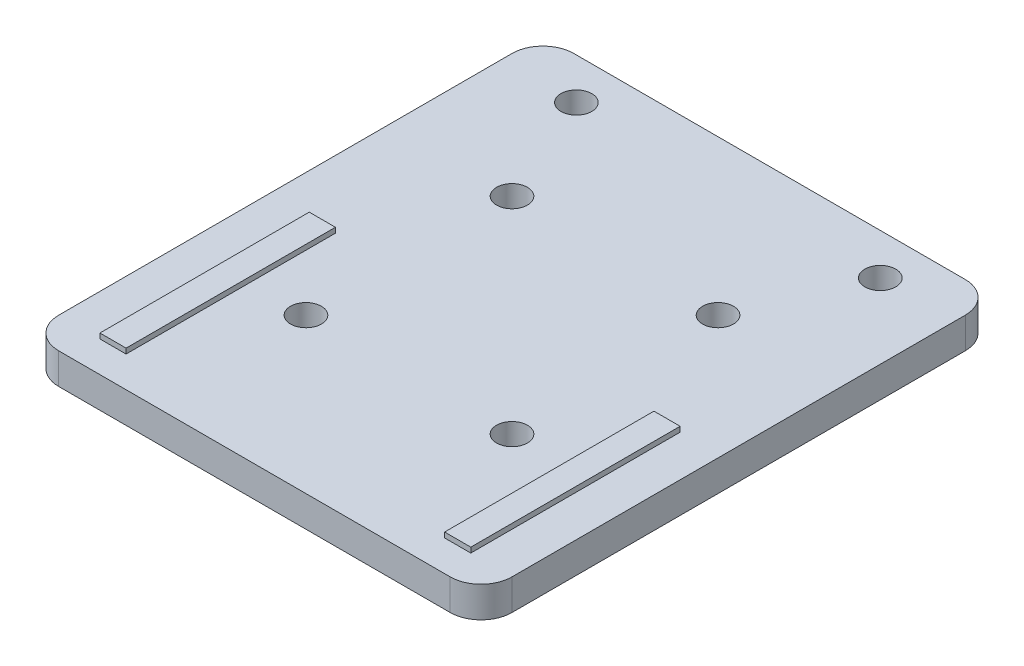
ISO-10303-21;
HEADER;
FILE_DESCRIPTION(('STEP AP214'),'2;1');
FILE_NAME('part.step','',(''),(''),'','','');
FILE_SCHEMA(('AUTOMOTIVE_DESIGN { 1 0 10303 214 1 1 1 1 }'));
ENDSEC;
DATA;
#1=APPLICATION_CONTEXT('core data for automotive mechanical design processes');
#2=APPLICATION_PROTOCOL_DEFINITION('international standard','automotive_design',2000,#1);
#3=PRODUCT_CONTEXT('',#1,'mechanical');
#4=PRODUCT('Part','Part','',(#3));
#5=PRODUCT_RELATED_PRODUCT_CATEGORY('part','',(#4));
#6=PRODUCT_DEFINITION_FORMATION('','',#4);
#7=PRODUCT_DEFINITION_CONTEXT('part definition',#1,'design');
#8=PRODUCT_DEFINITION('design','',#6,#7);
#9=PRODUCT_DEFINITION_SHAPE('','',#8);
#10=(LENGTH_UNIT() NAMED_UNIT(*) SI_UNIT(.MILLI.,.METRE.));
#11=(NAMED_UNIT(*) PLANE_ANGLE_UNIT() SI_UNIT($,.RADIAN.));
#12=(NAMED_UNIT(*) SI_UNIT($,.STERADIAN.) SOLID_ANGLE_UNIT());
#13=UNCERTAINTY_MEASURE_WITH_UNIT(LENGTH_MEASURE(1.E-05),#10,'distance_accuracy_value','');
#14=(GEOMETRIC_REPRESENTATION_CONTEXT(3) GLOBAL_UNCERTAINTY_ASSIGNED_CONTEXT((#13)) GLOBAL_UNIT_ASSIGNED_CONTEXT((#10,
#11,#12)) REPRESENTATION_CONTEXT('',''));
#15=CARTESIAN_POINT('',(0.,0.,0.));
#16=DIRECTION('',(0.,0.,1.));
#17=DIRECTION('',(1.,0.,0.));
#18=AXIS2_PLACEMENT_3D('',#15,#16,#17);
#19=CARTESIAN_POINT('',(0.,3.,0.));
#20=DIRECTION('',(0.,-1.,0.));
#21=DIRECTION('',(0.,0.,-1.));
#22=AXIS2_PLACEMENT_3D('',#19,#20,#21);
#23=PLANE('',#22);
#24=DIRECTION('',(1.,0.,0.));
#25=VECTOR('',#24,1.);
#26=CARTESIAN_POINT('',(-18.,3.,22.));
#27=LINE('',#26,#25);
#28=CARTESIAN_POINT('',(-18.,3.,22.));
#29=VERTEX_POINT('',#28);
#30=CARTESIAN_POINT('',(-15.46,3.,22.));
#31=VERTEX_POINT('',#30);
#32=EDGE_CURVE('E159',#29,#31,#27,.T.);
#33=ORIENTED_EDGE('',*,*,#32,.F.);
#34=DIRECTION('',(0.,0.,1.));
#35=VECTOR('',#34,1.);
#36=CARTESIAN_POINT('',(-18.,3.,1.68));
#37=LINE('',#36,#35);
#38=CARTESIAN_POINT('',(-18.,3.,1.68));
#39=VERTEX_POINT('',#38);
#40=EDGE_CURVE('E202',#39,#29,#37,.T.);
#41=ORIENTED_EDGE('',*,*,#40,.F.);
#42=DIRECTION('',(-1.,0.,0.));
#43=VECTOR('',#42,1.);
#44=CARTESIAN_POINT('',(-15.46,3.,1.68));
#45=LINE('',#44,#43);
#46=CARTESIAN_POINT('',(-15.46,3.,1.68));
#47=VERTEX_POINT('',#46);
#48=EDGE_CURVE('E219',#47,#39,#45,.T.);
#49=ORIENTED_EDGE('',*,*,#48,.F.);
#50=DIRECTION('',(0.,0.,-1.));
#51=VECTOR('',#50,1.);
#52=CARTESIAN_POINT('',(-15.46,3.,22.));
#53=LINE('',#52,#51);
#54=EDGE_CURVE('E215',#31,#47,#53,.T.);
#55=ORIENTED_EDGE('',*,*,#54,.F.);
#56=EDGE_LOOP('',(#33,#41,#49,#55));
#57=FACE_BOUND('',#56,.T.);
#58=DIRECTION('',(-1.,0.,0.));
#59=VECTOR('',#58,1.);
#60=CARTESIAN_POINT('',(-22.,3.,-25.));
#61=LINE('',#60,#59);
#62=CARTESIAN_POINT('',(19.,3.,-25.));
#63=VERTEX_POINT('',#62);
#64=CARTESIAN_POINT('',(-19.,3.,-25.));
#65=VERTEX_POINT('',#64);
#66=EDGE_CURVE('E294',#63,#65,#61,.T.);
#67=ORIENTED_EDGE('',*,*,#66,.T.);
#68=CARTESIAN_POINT('',(-19.,3.,-22.));
#69=DIRECTION('',(0.,-1.,0.));
#70=DIRECTION('',(0.,0.,-1.));
#71=AXIS2_PLACEMENT_3D('',#68,#69,#70);
#72=CIRCLE('',#71,3.);
#73=CARTESIAN_POINT('',(-22.,3.,-22.));
#74=VERTEX_POINT('',#73);
#75=EDGE_CURVE('E356',#65,#74,#72,.F.);
#76=ORIENTED_EDGE('',*,*,#75,.T.);
#77=DIRECTION('',(0.,0.,1.));
#78=VECTOR('',#77,1.);
#79=CARTESIAN_POINT('',(-22.,3.,25.));
#80=LINE('',#79,#78);
#81=CARTESIAN_POINT('',(-22.,3.,22.));
#82=VERTEX_POINT('',#81);
#83=EDGE_CURVE('E299',#74,#82,#80,.T.);
#84=ORIENTED_EDGE('',*,*,#83,.T.);
#85=CARTESIAN_POINT('',(-19.,3.,22.));
#86=DIRECTION('',(0.,-1.,0.));
#87=DIRECTION('',(0.,0.,-1.));
#88=AXIS2_PLACEMENT_3D('',#85,#86,#87);
#89=CIRCLE('',#88,3.);
#90=CARTESIAN_POINT('',(-19.,3.,25.));
#91=VERTEX_POINT('',#90);
#92=EDGE_CURVE('E353',#82,#91,#89,.F.);
#93=ORIENTED_EDGE('',*,*,#92,.T.);
#94=DIRECTION('',(1.,0.,0.));
#95=VECTOR('',#94,1.);
#96=CARTESIAN_POINT('',(-22.,3.,25.));
#97=LINE('',#96,#95);
#98=CARTESIAN_POINT('',(19.,3.,25.));
#99=VERTEX_POINT('',#98);
#100=EDGE_CURVE('E303',#91,#99,#97,.T.);
#101=ORIENTED_EDGE('',*,*,#100,.T.);
#102=CARTESIAN_POINT('',(19.,3.,22.));
#103=DIRECTION('',(0.,-1.,0.));
#104=DIRECTION('',(0.,0.,-1.));
#105=AXIS2_PLACEMENT_3D('',#102,#103,#104);
#106=CIRCLE('',#105,3.);
#107=CARTESIAN_POINT('',(22.,3.,22.));
#108=VERTEX_POINT('',#107);
#109=EDGE_CURVE('E347',#99,#108,#106,.F.);
#110=ORIENTED_EDGE('',*,*,#109,.T.);
#111=DIRECTION('',(0.,0.,-1.));
#112=VECTOR('',#111,1.);
#113=CARTESIAN_POINT('',(22.,3.,25.));
#114=LINE('',#113,#112);
#115=CARTESIAN_POINT('',(22.,3.,-22.));
#116=VERTEX_POINT('',#115);
#117=EDGE_CURVE('E290',#108,#116,#114,.T.);
#118=ORIENTED_EDGE('',*,*,#117,.T.);
#119=CARTESIAN_POINT('',(19.,3.,-22.));
#120=DIRECTION('',(0.,-1.,0.));
#121=DIRECTION('',(0.,0.,-1.));
#122=AXIS2_PLACEMENT_3D('',#119,#120,#121);
#123=CIRCLE('',#122,3.);
#124=EDGE_CURVE('E350',#116,#63,#123,.F.);
#125=ORIENTED_EDGE('',*,*,#124,.T.);
#126=EDGE_LOOP('',(#67,#76,#84,#93,#101,#110,#118,#125));
#127=FACE_BOUND('',#126,.T.);
#128=CARTESIAN_POINT('',(-10.,3.,-10.));
#129=DIRECTION('',(0.,1.,0.));
#130=DIRECTION('',(0.,0.,1.));
#131=AXIS2_PLACEMENT_3D('',#128,#129,#130);
#132=CIRCLE('',#131,1.5);
#133=CARTESIAN_POINT('',(-10.,3.,-8.50000000000001));
#134=VERTEX_POINT('',#133);
#135=EDGE_CURVE('E282',#134,#134,#132,.T.);
#136=ORIENTED_EDGE('',*,*,#135,.F.);
#137=EDGE_LOOP('',(#136));
#138=FACE_BOUND('',#137,.T.);
#139=CARTESIAN_POINT('',(10.,3.,-10.));
#140=DIRECTION('',(0.,1.,0.));
#141=DIRECTION('',(0.,0.,-1.));
#142=AXIS2_PLACEMENT_3D('',#139,#140,#141);
#143=CIRCLE('',#142,1.5);
#144=CARTESIAN_POINT('',(10.,3.,-11.5));
#145=VERTEX_POINT('',#144);
#146=EDGE_CURVE('E274',#145,#145,#143,.T.);
#147=ORIENTED_EDGE('',*,*,#146,.F.);
#148=EDGE_LOOP('',(#147));
#149=FACE_BOUND('',#148,.T.);
#150=CARTESIAN_POINT('',(10.,3.,9.99999999999999));
#151=DIRECTION('',(0.,1.,0.));
#152=DIRECTION('',(0.,0.,1.));
#153=AXIS2_PLACEMENT_3D('',#150,#151,#152);
#154=CIRCLE('',#153,1.5);
#155=CARTESIAN_POINT('',(10.,3.,11.5));
#156=VERTEX_POINT('',#155);
#157=EDGE_CURVE('E266',#156,#156,#154,.T.);
#158=ORIENTED_EDGE('',*,*,#157,.F.);
#159=EDGE_LOOP('',(#158));
#160=FACE_BOUND('',#159,.T.);
#161=CARTESIAN_POINT('',(-10.,3.,9.99999999999999));
#162=DIRECTION('',(0.,1.,0.));
#163=DIRECTION('',(0.,0.,-1.));
#164=AXIS2_PLACEMENT_3D('',#161,#162,#163);
#165=CIRCLE('',#164,1.5);
#166=CARTESIAN_POINT('',(-10.,3.,8.49999999999999));
#167=VERTEX_POINT('',#166);
#168=EDGE_CURVE('E258',#167,#167,#165,.T.);
#169=ORIENTED_EDGE('',*,*,#168,.F.);
#170=EDGE_LOOP('',(#169));
#171=FACE_BOUND('',#170,.T.);
#172=CARTESIAN_POINT('',(-14.75,3.,-21.));
#173=DIRECTION('',(0.,1.,0.));
#174=DIRECTION('',(0.,0.,1.));
#175=AXIS2_PLACEMENT_3D('',#172,#173,#174);
#176=CIRCLE('',#175,1.5);
#177=CARTESIAN_POINT('',(-14.75,3.,-19.5));
#178=VERTEX_POINT('',#177);
#179=EDGE_CURVE('E250',#178,#178,#176,.T.);
#180=ORIENTED_EDGE('',*,*,#179,.F.);
#181=EDGE_LOOP('',(#180));
#182=FACE_BOUND('',#181,.T.);
#183=CARTESIAN_POINT('',(14.75,3.,-21.));
#184=DIRECTION('',(0.,1.,0.));
#185=DIRECTION('',(0.,0.,-1.));
#186=AXIS2_PLACEMENT_3D('',#183,#184,#185);
#187=CIRCLE('',#186,1.5);
#188=CARTESIAN_POINT('',(14.75,3.,-22.5));
#189=VERTEX_POINT('',#188);
#190=EDGE_CURVE('E242',#189,#189,#187,.T.);
#191=ORIENTED_EDGE('',*,*,#190,.F.);
#192=EDGE_LOOP('',(#191));
#193=FACE_BOUND('',#192,.T.);
#194=DIRECTION('',(-1.,0.,0.));
#195=VECTOR('',#194,1.);
#196=CARTESIAN_POINT('',(15.46,3.,1.68));
#197=LINE('',#196,#195);
#198=CARTESIAN_POINT('',(18.,3.,1.68));
#199=VERTEX_POINT('',#198);
#200=CARTESIAN_POINT('',(15.46,3.,1.68));
#201=VERTEX_POINT('',#200);
#202=EDGE_CURVE('E152',#199,#201,#197,.T.);
#203=ORIENTED_EDGE('',*,*,#202,.F.);
#204=DIRECTION('',(0.,0.,-1.));
#205=VECTOR('',#204,1.);
#206=CARTESIAN_POINT('',(18.,3.,1.68));
#207=LINE('',#206,#205);
#208=CARTESIAN_POINT('',(18.,3.,22.));
#209=VERTEX_POINT('',#208);
#210=EDGE_CURVE('E154',#209,#199,#207,.T.);
#211=ORIENTED_EDGE('',*,*,#210,.F.);
#212=DIRECTION('',(1.,0.,0.));
#213=VECTOR('',#212,1.);
#214=CARTESIAN_POINT('',(18.,3.,22.));
#215=LINE('',#214,#213);
#216=CARTESIAN_POINT('',(15.46,3.,22.));
#217=VERTEX_POINT('',#216);
#218=EDGE_CURVE('E64',#217,#209,#215,.T.);
#219=ORIENTED_EDGE('',*,*,#218,.F.);
#220=DIRECTION('',(0.,0.,1.));
#221=VECTOR('',#220,1.);
#222=CARTESIAN_POINT('',(15.46,3.,22.));
#223=LINE('',#222,#221);
#224=EDGE_CURVE('E59',#201,#217,#223,.T.);
#225=ORIENTED_EDGE('',*,*,#224,.F.);
#226=EDGE_LOOP('',(#203,#211,#219,#225));
#227=FACE_BOUND('',#226,.T.);
#228=ADVANCED_FACE('F43',(#57,#127,#138,#149,#160,#171,#182,#193,#227),#23,.F.);
#229=CARTESIAN_POINT('',(0.,0.,0.));
#230=DIRECTION('',(0.,-1.,0.));
#231=DIRECTION('',(0.,0.,-1.));
#232=AXIS2_PLACEMENT_3D('',#229,#230,#231);
#233=PLANE('',#232);
#234=CARTESIAN_POINT('',(-14.75,0.,-21.));
#235=DIRECTION('',(0.,1.,0.));
#236=DIRECTION('',(0.,0.,1.));
#237=AXIS2_PLACEMENT_3D('',#234,#235,#236);
#238=CIRCLE('',#237,1.5);
#239=CARTESIAN_POINT('',(-14.75,0.,-19.5));
#240=VERTEX_POINT('',#239);
#241=EDGE_CURVE('E246',#240,#240,#238,.T.);
#242=ORIENTED_EDGE('',*,*,#241,.T.);
#243=EDGE_LOOP('',(#242));
#244=FACE_BOUND('',#243,.T.);
#245=CARTESIAN_POINT('',(10.,0.,9.99999999999999));
#246=DIRECTION('',(0.,1.,0.));
#247=DIRECTION('',(0.,0.,1.));
#248=AXIS2_PLACEMENT_3D('',#245,#246,#247);
#249=CIRCLE('',#248,1.5);
#250=CARTESIAN_POINT('',(10.,0.,11.5));
#251=VERTEX_POINT('',#250);
#252=EDGE_CURVE('E262',#251,#251,#249,.T.);
#253=ORIENTED_EDGE('',*,*,#252,.T.);
#254=EDGE_LOOP('',(#253));
#255=FACE_BOUND('',#254,.T.);
#256=CARTESIAN_POINT('',(-10.,0.,-10.));
#257=DIRECTION('',(0.,1.,0.));
#258=DIRECTION('',(0.,0.,1.));
#259=AXIS2_PLACEMENT_3D('',#256,#257,#258);
#260=CIRCLE('',#259,1.5);
#261=CARTESIAN_POINT('',(-10.,0.,-8.50000000000001));
#262=VERTEX_POINT('',#261);
#263=EDGE_CURVE('E278',#262,#262,#260,.T.);
#264=ORIENTED_EDGE('',*,*,#263,.T.);
#265=EDGE_LOOP('',(#264));
#266=FACE_BOUND('',#265,.T.);
#267=DIRECTION('',(0.,0.,1.));
#268=VECTOR('',#267,1.);
#269=CARTESIAN_POINT('',(-22.,0.,25.));
#270=LINE('',#269,#268);
#271=CARTESIAN_POINT('',(-22.,0.,-22.));
#272=VERTEX_POINT('',#271);
#273=CARTESIAN_POINT('',(-22.,0.,22.));
#274=VERTEX_POINT('',#273);
#275=EDGE_CURVE('E315',#272,#274,#270,.T.);
#276=ORIENTED_EDGE('',*,*,#275,.F.);
#277=CARTESIAN_POINT('',(-19.,0.,-22.));
#278=DIRECTION('',(0.,-1.,0.));
#279=DIRECTION('',(0.,0.,-1.));
#280=AXIS2_PLACEMENT_3D('',#277,#278,#279);
#281=CIRCLE('',#280,3.);
#282=CARTESIAN_POINT('',(-19.,0.,-25.));
#283=VERTEX_POINT('',#282);
#284=EDGE_CURVE('E337',#272,#283,#281,.T.);
#285=ORIENTED_EDGE('',*,*,#284,.T.);
#286=DIRECTION('',(-1.,0.,0.));
#287=VECTOR('',#286,1.);
#288=CARTESIAN_POINT('',(-22.,0.,-25.));
#289=LINE('',#288,#287);
#290=CARTESIAN_POINT('',(19.,0.,-25.));
#291=VERTEX_POINT('',#290);
#292=EDGE_CURVE('E311',#291,#283,#289,.T.);
#293=ORIENTED_EDGE('',*,*,#292,.F.);
#294=CARTESIAN_POINT('',(19.,0.,-22.));
#295=DIRECTION('',(0.,-1.,0.));
#296=DIRECTION('',(0.,0.,-1.));
#297=AXIS2_PLACEMENT_3D('',#294,#295,#296);
#298=CIRCLE('',#297,3.);
#299=CARTESIAN_POINT('',(22.,0.,-22.));
#300=VERTEX_POINT('',#299);
#301=EDGE_CURVE('E331',#291,#300,#298,.T.);
#302=ORIENTED_EDGE('',*,*,#301,.T.);
#303=DIRECTION('',(0.,0.,-1.));
#304=VECTOR('',#303,1.);
#305=CARTESIAN_POINT('',(22.,0.,25.));
#306=LINE('',#305,#304);
#307=CARTESIAN_POINT('',(22.,0.,22.));
#308=VERTEX_POINT('',#307);
#309=EDGE_CURVE('E286',#308,#300,#306,.T.);
#310=ORIENTED_EDGE('',*,*,#309,.F.);
#311=CARTESIAN_POINT('',(19.,0.,22.));
#312=DIRECTION('',(0.,-1.,0.));
#313=DIRECTION('',(0.,0.,-1.));
#314=AXIS2_PLACEMENT_3D('',#311,#312,#313);
#315=CIRCLE('',#314,3.);
#316=CARTESIAN_POINT('',(19.,0.,25.));
#317=VERTEX_POINT('',#316);
#318=EDGE_CURVE('E328',#308,#317,#315,.T.);
#319=ORIENTED_EDGE('',*,*,#318,.T.);
#320=DIRECTION('',(1.,0.,0.));
#321=VECTOR('',#320,1.);
#322=CARTESIAN_POINT('',(-22.,0.,25.));
#323=LINE('',#322,#321);
#324=CARTESIAN_POINT('',(-19.,0.,25.));
#325=VERTEX_POINT('',#324);
#326=EDGE_CURVE('E295',#325,#317,#323,.T.);
#327=ORIENTED_EDGE('',*,*,#326,.F.);
#328=CARTESIAN_POINT('',(-19.,0.,22.));
#329=DIRECTION('',(0.,-1.,0.));
#330=DIRECTION('',(0.,0.,-1.));
#331=AXIS2_PLACEMENT_3D('',#328,#329,#330);
#332=CIRCLE('',#331,3.);
#333=EDGE_CURVE('E334',#325,#274,#332,.T.);
#334=ORIENTED_EDGE('',*,*,#333,.T.);
#335=EDGE_LOOP('',(#276,#285,#293,#302,#310,#319,#327,#334));
#336=FACE_BOUND('',#335,.T.);
#337=CARTESIAN_POINT('',(10.,0.,-10.));
#338=DIRECTION('',(0.,1.,0.));
#339=DIRECTION('',(0.,0.,-1.));
#340=AXIS2_PLACEMENT_3D('',#337,#338,#339);
#341=CIRCLE('',#340,1.5);
#342=CARTESIAN_POINT('',(10.,0.,-11.5));
#343=VERTEX_POINT('',#342);
#344=EDGE_CURVE('E270',#343,#343,#341,.T.);
#345=ORIENTED_EDGE('',*,*,#344,.T.);
#346=EDGE_LOOP('',(#345));
#347=FACE_BOUND('',#346,.T.);
#348=CARTESIAN_POINT('',(-10.,0.,9.99999999999999));
#349=DIRECTION('',(0.,1.,0.));
#350=DIRECTION('',(0.,0.,-1.));
#351=AXIS2_PLACEMENT_3D('',#348,#349,#350);
#352=CIRCLE('',#351,1.5);
#353=CARTESIAN_POINT('',(-10.,0.,8.49999999999999));
#354=VERTEX_POINT('',#353);
#355=EDGE_CURVE('E254',#354,#354,#352,.T.);
#356=ORIENTED_EDGE('',*,*,#355,.T.);
#357=EDGE_LOOP('',(#356));
#358=FACE_BOUND('',#357,.T.);
#359=CARTESIAN_POINT('',(14.75,0.,-21.));
#360=DIRECTION('',(0.,1.,0.));
#361=DIRECTION('',(0.,0.,-1.));
#362=AXIS2_PLACEMENT_3D('',#359,#360,#361);
#363=CIRCLE('',#362,1.5);
#364=CARTESIAN_POINT('',(14.75,0.,-22.5));
#365=VERTEX_POINT('',#364);
#366=EDGE_CURVE('E241',#365,#365,#363,.T.);
#367=ORIENTED_EDGE('',*,*,#366,.T.);
#368=EDGE_LOOP('',(#367));
#369=FACE_BOUND('',#368,.T.);
#370=ADVANCED_FACE('F377',(#244,#255,#266,#336,#347,#358,#369),#233,.T.);
#371=CARTESIAN_POINT('',(22.,3.,25.));
#372=DIRECTION('',(-1.,0.,0.));
#373=DIRECTION('',(0.,0.,1.));
#374=AXIS2_PLACEMENT_3D('',#371,#372,#373);
#375=PLANE('',#374);
#376=ORIENTED_EDGE('',*,*,#309,.T.);
#377=DIRECTION('',(0.,-1.,0.));
#378=VECTOR('',#377,1.);
#379=CARTESIAN_POINT('',(22.,3.,-22.));
#380=LINE('',#379,#378);
#381=EDGE_CURVE('E11',#300,#116,#380,.F.);
#382=ORIENTED_EDGE('',*,*,#381,.T.);
#383=ORIENTED_EDGE('',*,*,#117,.F.);
#384=DIRECTION('',(0.,-1.,0.));
#385=VECTOR('',#384,1.);
#386=CARTESIAN_POINT('',(22.,3.,22.));
#387=LINE('',#386,#385);
#388=EDGE_CURVE('E52',#108,#308,#387,.T.);
#389=ORIENTED_EDGE('',*,*,#388,.T.);
#390=EDGE_LOOP('',(#376,#382,#383,#389));
#391=FACE_BOUND('',#390,.T.);
#392=ADVANCED_FACE('F371',(#391),#375,.F.);
#393=CARTESIAN_POINT('',(-22.,3.,-25.));
#394=DIRECTION('',(0.,0.,1.));
#395=DIRECTION('',(1.,0.,0.));
#396=AXIS2_PLACEMENT_3D('',#393,#394,#395);
#397=PLANE('',#396);
#398=ORIENTED_EDGE('',*,*,#292,.T.);
#399=DIRECTION('',(0.,-1.,0.));
#400=VECTOR('',#399,1.);
#401=CARTESIAN_POINT('',(-19.,3.,-25.));
#402=LINE('',#401,#400);
#403=EDGE_CURVE('E344',#283,#65,#402,.F.);
#404=ORIENTED_EDGE('',*,*,#403,.T.);
#405=ORIENTED_EDGE('',*,*,#66,.F.);
#406=DIRECTION('',(0.,-1.,0.));
#407=VECTOR('',#406,1.);
#408=CARTESIAN_POINT('',(19.,3.,-25.));
#409=LINE('',#408,#407);
#410=EDGE_CURVE('E340',#63,#291,#409,.T.);
#411=ORIENTED_EDGE('',*,*,#410,.T.);
#412=EDGE_LOOP('',(#398,#404,#405,#411));
#413=FACE_BOUND('',#412,.T.);
#414=ADVANCED_FACE('F387',(#413),#397,.F.);
#415=CARTESIAN_POINT('',(-22.,3.,25.));
#416=DIRECTION('',(1.,0.,0.));
#417=DIRECTION('',(0.,0.,-1.));
#418=AXIS2_PLACEMENT_3D('',#415,#416,#417);
#419=PLANE('',#418);
#420=ORIENTED_EDGE('',*,*,#83,.F.);
#421=DIRECTION('',(0.,-1.,0.));
#422=VECTOR('',#421,1.);
#423=CARTESIAN_POINT('',(-22.,3.,-22.));
#424=LINE('',#423,#422);
#425=EDGE_CURVE('E324',#74,#272,#424,.T.);
#426=ORIENTED_EDGE('',*,*,#425,.T.);
#427=ORIENTED_EDGE('',*,*,#275,.T.);
#428=DIRECTION('',(0.,-1.,0.));
#429=VECTOR('',#428,1.);
#430=CARTESIAN_POINT('',(-22.,3.,22.));
#431=LINE('',#430,#429);
#432=EDGE_CURVE('E307',#274,#82,#431,.F.);
#433=ORIENTED_EDGE('',*,*,#432,.T.);
#434=EDGE_LOOP('',(#420,#426,#427,#433));
#435=FACE_BOUND('',#434,.T.);
#436=ADVANCED_FACE('F397',(#435),#419,.F.);
#437=CARTESIAN_POINT('',(-22.,3.,25.));
#438=DIRECTION('',(0.,0.,-1.));
#439=DIRECTION('',(-1.,0.,0.));
#440=AXIS2_PLACEMENT_3D('',#437,#438,#439);
#441=PLANE('',#440);
#442=ORIENTED_EDGE('',*,*,#100,.F.);
#443=DIRECTION('',(0.,-1.,0.));
#444=VECTOR('',#443,1.);
#445=CARTESIAN_POINT('',(-19.,3.,25.));
#446=LINE('',#445,#444);
#447=EDGE_CURVE('E362',#91,#325,#446,.T.);
#448=ORIENTED_EDGE('',*,*,#447,.T.);
#449=ORIENTED_EDGE('',*,*,#326,.T.);
#450=DIRECTION('',(0.,-1.,0.));
#451=VECTOR('',#450,1.);
#452=CARTESIAN_POINT('',(19.,3.,25.));
#453=LINE('',#452,#451);
#454=EDGE_CURVE('E359',#317,#99,#453,.F.);
#455=ORIENTED_EDGE('',*,*,#454,.T.);
#456=EDGE_LOOP('',(#442,#448,#449,#455));
#457=FACE_BOUND('',#456,.T.);
#458=ADVANCED_FACE('F405',(#457),#441,.F.);
#459=CARTESIAN_POINT('',(-10.,3.,-10.));
#460=DIRECTION('',(0.,-1.,0.));
#461=DIRECTION('',(0.,0.,-1.));
#462=AXIS2_PLACEMENT_3D('',#459,#460,#461);
#463=CYLINDRICAL_SURFACE('',#462,1.5);
#464=ORIENTED_EDGE('',*,*,#135,.T.);
#465=EDGE_LOOP('',(#464));
#466=FACE_BOUND('',#465,.T.);
#467=ORIENTED_EDGE('',*,*,#263,.F.);
#468=EDGE_LOOP('',(#467));
#469=FACE_BOUND('',#468,.T.);
#470=ADVANCED_FACE('F426',(#466,#469),#463,.F.);
#471=CARTESIAN_POINT('',(10.,3.,-10.));
#472=DIRECTION('',(0.,-1.,0.));
#473=DIRECTION('',(0.,0.,-1.));
#474=AXIS2_PLACEMENT_3D('',#471,#472,#473);
#475=CYLINDRICAL_SURFACE('',#474,1.5);
#476=ORIENTED_EDGE('',*,*,#146,.T.);
#477=EDGE_LOOP('',(#476));
#478=FACE_BOUND('',#477,.T.);
#479=ORIENTED_EDGE('',*,*,#344,.F.);
#480=EDGE_LOOP('',(#479));
#481=FACE_BOUND('',#480,.T.);
#482=ADVANCED_FACE('F590',(#478,#481),#475,.F.);
#483=CARTESIAN_POINT('',(10.,3.,9.99999999999999));
#484=DIRECTION('',(0.,-1.,0.));
#485=DIRECTION('',(0.,0.,-1.));
#486=AXIS2_PLACEMENT_3D('',#483,#484,#485);
#487=CYLINDRICAL_SURFACE('',#486,1.5);
#488=ORIENTED_EDGE('',*,*,#157,.T.);
#489=EDGE_LOOP('',(#488));
#490=FACE_BOUND('',#489,.T.);
#491=ORIENTED_EDGE('',*,*,#252,.F.);
#492=EDGE_LOOP('',(#491));
#493=FACE_BOUND('',#492,.T.);
#494=ADVANCED_FACE('F587',(#490,#493),#487,.F.);
#495=CARTESIAN_POINT('',(-10.,3.,9.99999999999999));
#496=DIRECTION('',(0.,-1.,0.));
#497=DIRECTION('',(0.,0.,-1.));
#498=AXIS2_PLACEMENT_3D('',#495,#496,#497);
#499=CYLINDRICAL_SURFACE('',#498,1.5);
#500=ORIENTED_EDGE('',*,*,#168,.T.);
#501=EDGE_LOOP('',(#500));
#502=FACE_BOUND('',#501,.T.);
#503=ORIENTED_EDGE('',*,*,#355,.F.);
#504=EDGE_LOOP('',(#503));
#505=FACE_BOUND('',#504,.T.);
#506=ADVANCED_FACE('F583',(#502,#505),#499,.F.);
#507=CARTESIAN_POINT('',(-14.75,3.,-21.));
#508=DIRECTION('',(0.,-1.,0.));
#509=DIRECTION('',(0.,0.,-1.));
#510=AXIS2_PLACEMENT_3D('',#507,#508,#509);
#511=CYLINDRICAL_SURFACE('',#510,1.5);
#512=ORIENTED_EDGE('',*,*,#179,.T.);
#513=EDGE_LOOP('',(#512));
#514=FACE_BOUND('',#513,.T.);
#515=ORIENTED_EDGE('',*,*,#241,.F.);
#516=EDGE_LOOP('',(#515));
#517=FACE_BOUND('',#516,.T.);
#518=ADVANCED_FACE('F579',(#514,#517),#511,.F.);
#519=CARTESIAN_POINT('',(14.75,3.,-21.));
#520=DIRECTION('',(0.,-1.,0.));
#521=DIRECTION('',(0.,0.,-1.));
#522=AXIS2_PLACEMENT_3D('',#519,#520,#521);
#523=CYLINDRICAL_SURFACE('',#522,1.5);
#524=ORIENTED_EDGE('',*,*,#190,.T.);
#525=EDGE_LOOP('',(#524));
#526=FACE_BOUND('',#525,.T.);
#527=ORIENTED_EDGE('',*,*,#366,.F.);
#528=EDGE_LOOP('',(#527));
#529=FACE_BOUND('',#528,.T.);
#530=ADVANCED_FACE('F439',(#526,#529),#523,.F.);
#531=CARTESIAN_POINT('',(-19.,3.,-22.));
#532=DIRECTION('',(0.,-1.,0.));
#533=DIRECTION('',(0.,0.,-1.));
#534=AXIS2_PLACEMENT_3D('',#531,#532,#533);
#535=CYLINDRICAL_SURFACE('',#534,3.);
#536=ORIENTED_EDGE('',*,*,#75,.F.);
#537=ORIENTED_EDGE('',*,*,#403,.F.);
#538=ORIENTED_EDGE('',*,*,#284,.F.);
#539=ORIENTED_EDGE('',*,*,#425,.F.);
#540=EDGE_LOOP('',(#536,#537,#538,#539));
#541=FACE_BOUND('',#540,.T.);
#542=ADVANCED_FACE('F395',(#541),#535,.T.);
#543=CARTESIAN_POINT('',(-19.,3.,22.));
#544=DIRECTION('',(0.,-1.,0.));
#545=DIRECTION('',(0.,0.,-1.));
#546=AXIS2_PLACEMENT_3D('',#543,#544,#545);
#547=CYLINDRICAL_SURFACE('',#546,3.);
#548=ORIENTED_EDGE('',*,*,#92,.F.);
#549=ORIENTED_EDGE('',*,*,#432,.F.);
#550=ORIENTED_EDGE('',*,*,#333,.F.);
#551=ORIENTED_EDGE('',*,*,#447,.F.);
#552=EDGE_LOOP('',(#548,#549,#550,#551));
#553=FACE_BOUND('',#552,.T.);
#554=ADVANCED_FACE('F402',(#553),#547,.T.);
#555=CARTESIAN_POINT('',(19.,3.,-22.));
#556=DIRECTION('',(0.,-1.,0.));
#557=DIRECTION('',(0.,0.,-1.));
#558=AXIS2_PLACEMENT_3D('',#555,#556,#557);
#559=CYLINDRICAL_SURFACE('',#558,3.);
#560=ORIENTED_EDGE('',*,*,#124,.F.);
#561=ORIENTED_EDGE('',*,*,#381,.F.);
#562=ORIENTED_EDGE('',*,*,#301,.F.);
#563=ORIENTED_EDGE('',*,*,#410,.F.);
#564=EDGE_LOOP('',(#560,#561,#562,#563));
#565=FACE_BOUND('',#564,.T.);
#566=ADVANCED_FACE('F384',(#565),#559,.T.);
#567=CARTESIAN_POINT('',(19.,3.,22.));
#568=DIRECTION('',(0.,-1.,0.));
#569=DIRECTION('',(0.,0.,-1.));
#570=AXIS2_PLACEMENT_3D('',#567,#568,#569);
#571=CYLINDRICAL_SURFACE('',#570,3.);
#572=ORIENTED_EDGE('',*,*,#109,.F.);
#573=ORIENTED_EDGE('',*,*,#454,.F.);
#574=ORIENTED_EDGE('',*,*,#318,.F.);
#575=ORIENTED_EDGE('',*,*,#388,.F.);
#576=EDGE_LOOP('',(#572,#573,#574,#575));
#577=FACE_BOUND('',#576,.T.);
#578=ADVANCED_FACE('F45',(#577),#571,.T.);
#579=CARTESIAN_POINT('',(-18.,3.5,22.));
#580=DIRECTION('',(0.,0.,-1.));
#581=DIRECTION('',(-1.,0.,0.));
#582=AXIS2_PLACEMENT_3D('',#579,#580,#581);
#583=PLANE('',#582);
#584=ORIENTED_EDGE('',*,*,#32,.T.);
#585=DIRECTION('',(0.,-1.,0.));
#586=VECTOR('',#585,1.);
#587=CARTESIAN_POINT('',(-15.46,3.5,22.));
#588=LINE('',#587,#586);
#589=CARTESIAN_POINT('',(-15.46,3.5,22.));
#590=VERTEX_POINT('',#589);
#591=EDGE_CURVE('E237',#590,#31,#588,.T.);
#592=ORIENTED_EDGE('',*,*,#591,.F.);
#593=DIRECTION('',(1.,0.,0.));
#594=VECTOR('',#593,1.);
#595=CARTESIAN_POINT('',(-18.,3.5,22.));
#596=LINE('',#595,#594);
#597=CARTESIAN_POINT('',(-18.,3.5,22.));
#598=VERTEX_POINT('',#597);
#599=EDGE_CURVE('E197',#598,#590,#596,.T.);
#600=ORIENTED_EDGE('',*,*,#599,.F.);
#601=DIRECTION('',(0.,-1.,0.));
#602=VECTOR('',#601,1.);
#603=CARTESIAN_POINT('',(-18.,3.5,22.));
#604=LINE('',#603,#602);
#605=EDGE_CURVE('E211',#598,#29,#604,.T.);
#606=ORIENTED_EDGE('',*,*,#605,.T.);
#607=EDGE_LOOP('',(#584,#592,#600,#606));
#608=FACE_BOUND('',#607,.T.);
#609=ADVANCED_FACE('F408',(#608),#583,.F.);
#610=CARTESIAN_POINT('',(-15.46,3.5,22.));
#611=DIRECTION('',(-1.,0.,0.));
#612=DIRECTION('',(0.,0.,1.));
#613=AXIS2_PLACEMENT_3D('',#610,#611,#612);
#614=PLANE('',#613);
#615=ORIENTED_EDGE('',*,*,#54,.T.);
#616=DIRECTION('',(0.,-1.,0.));
#617=VECTOR('',#616,1.);
#618=CARTESIAN_POINT('',(-15.46,3.5,1.68));
#619=LINE('',#618,#617);
#620=CARTESIAN_POINT('',(-15.46,3.5,1.68));
#621=VERTEX_POINT('',#620);
#622=EDGE_CURVE('E233',#621,#47,#619,.T.);
#623=ORIENTED_EDGE('',*,*,#622,.F.);
#624=DIRECTION('',(0.,0.,-1.));
#625=VECTOR('',#624,1.);
#626=CARTESIAN_POINT('',(-15.46,3.5,22.));
#627=LINE('',#626,#625);
#628=EDGE_CURVE('E201',#590,#621,#627,.T.);
#629=ORIENTED_EDGE('',*,*,#628,.F.);
#630=ORIENTED_EDGE('',*,*,#591,.T.);
#631=EDGE_LOOP('',(#615,#623,#629,#630));
#632=FACE_BOUND('',#631,.T.);
#633=ADVANCED_FACE('F414',(#632),#614,.F.);
#634=CARTESIAN_POINT('',(-15.46,3.5,1.68));
#635=DIRECTION('',(0.,0.,1.));
#636=DIRECTION('',(1.,0.,0.));
#637=AXIS2_PLACEMENT_3D('',#634,#635,#636);
#638=PLANE('',#637);
#639=ORIENTED_EDGE('',*,*,#48,.T.);
#640=DIRECTION('',(0.,-1.,0.));
#641=VECTOR('',#640,1.);
#642=CARTESIAN_POINT('',(-18.,3.5,1.68));
#643=LINE('',#642,#641);
#644=CARTESIAN_POINT('',(-18.,3.5,1.68));
#645=VERTEX_POINT('',#644);
#646=EDGE_CURVE('E229',#645,#39,#643,.T.);
#647=ORIENTED_EDGE('',*,*,#646,.F.);
#648=DIRECTION('',(-1.,0.,0.));
#649=VECTOR('',#648,1.);
#650=CARTESIAN_POINT('',(-15.46,3.5,1.68));
#651=LINE('',#650,#649);
#652=EDGE_CURVE('E205',#621,#645,#651,.T.);
#653=ORIENTED_EDGE('',*,*,#652,.F.);
#654=ORIENTED_EDGE('',*,*,#622,.T.);
#655=EDGE_LOOP('',(#639,#647,#653,#654));
#656=FACE_BOUND('',#655,.T.);
#657=ADVANCED_FACE('F480',(#656),#638,.F.);
#658=CARTESIAN_POINT('',(-18.,3.5,1.68));
#659=DIRECTION('',(1.,0.,0.));
#660=DIRECTION('',(0.,0.,-1.));
#661=AXIS2_PLACEMENT_3D('',#658,#659,#660);
#662=PLANE('',#661);
#663=ORIENTED_EDGE('',*,*,#40,.T.);
#664=ORIENTED_EDGE('',*,*,#605,.F.);
#665=DIRECTION('',(0.,0.,1.));
#666=VECTOR('',#665,1.);
#667=CARTESIAN_POINT('',(-18.,3.5,1.68));
#668=LINE('',#667,#666);
#669=EDGE_CURVE('E208',#645,#598,#668,.T.);
#670=ORIENTED_EDGE('',*,*,#669,.F.);
#671=ORIENTED_EDGE('',*,*,#646,.T.);
#672=EDGE_LOOP('',(#663,#664,#670,#671));
#673=FACE_BOUND('',#672,.T.);
#674=ADVANCED_FACE('F491',(#673),#662,.F.);
#675=CARTESIAN_POINT('',(0.,3.5,0.));
#676=DIRECTION('',(0.,1.,0.));
#677=DIRECTION('',(0.,0.,1.));
#678=AXIS2_PLACEMENT_3D('',#675,#676,#677);
#679=PLANE('',#678);
#680=ORIENTED_EDGE('',*,*,#599,.T.);
#681=ORIENTED_EDGE('',*,*,#628,.T.);
#682=ORIENTED_EDGE('',*,*,#652,.T.);
#683=ORIENTED_EDGE('',*,*,#669,.T.);
#684=EDGE_LOOP('',(#680,#681,#682,#683));
#685=FACE_BOUND('',#684,.T.);
#686=ADVANCED_FACE('F502',(#685),#679,.T.);
#687=CARTESIAN_POINT('',(15.46,3.5,1.68));
#688=DIRECTION('',(0.,0.,1.));
#689=DIRECTION('',(1.,0.,0.));
#690=AXIS2_PLACEMENT_3D('',#687,#688,#689);
#691=PLANE('',#690);
#692=ORIENTED_EDGE('',*,*,#202,.T.);
#693=DIRECTION('',(0.,-1.,0.));
#694=VECTOR('',#693,1.);
#695=CARTESIAN_POINT('',(15.46,3.5,1.68));
#696=LINE('',#695,#694);
#697=CARTESIAN_POINT('',(15.46,3.5,1.68));
#698=VERTEX_POINT('',#697);
#699=EDGE_CURVE('E723',#698,#201,#696,.T.);
#700=ORIENTED_EDGE('',*,*,#699,.F.);
#701=DIRECTION('',(-1.,0.,0.));
#702=VECTOR('',#701,1.);
#703=CARTESIAN_POINT('',(15.46,3.5,1.68));
#704=LINE('',#703,#702);
#705=CARTESIAN_POINT('',(18.,3.5,1.68));
#706=VERTEX_POINT('',#705);
#707=EDGE_CURVE('E171',#706,#698,#704,.T.);
#708=ORIENTED_EDGE('',*,*,#707,.F.);
#709=DIRECTION('',(0.,-1.,0.));
#710=VECTOR('',#709,1.);
#711=CARTESIAN_POINT('',(18.,3.5,1.68));
#712=LINE('',#711,#710);
#713=EDGE_CURVE('E166',#706,#199,#712,.T.);
#714=ORIENTED_EDGE('',*,*,#713,.T.);
#715=EDGE_LOOP('',(#692,#700,#708,#714));
#716=FACE_BOUND('',#715,.T.);
#717=ADVANCED_FACE('F173',(#716),#691,.F.);
#718=CARTESIAN_POINT('',(15.46,3.5,22.));
#719=DIRECTION('',(1.,0.,0.));
#720=DIRECTION('',(0.,0.,-1.));
#721=AXIS2_PLACEMENT_3D('',#718,#719,#720);
#722=PLANE('',#721);
#723=ORIENTED_EDGE('',*,*,#224,.T.);
#724=DIRECTION('',(0.,-1.,0.));
#725=VECTOR('',#724,1.);
#726=CARTESIAN_POINT('',(15.46,3.5,22.));
#727=LINE('',#726,#725);
#728=CARTESIAN_POINT('',(15.46,3.5,22.));
#729=VERTEX_POINT('',#728);
#730=EDGE_CURVE('E182',#729,#217,#727,.T.);
#731=ORIENTED_EDGE('',*,*,#730,.F.);
#732=DIRECTION('',(0.,0.,1.));
#733=VECTOR('',#732,1.);
#734=CARTESIAN_POINT('',(15.46,3.5,22.));
#735=LINE('',#734,#733);
#736=EDGE_CURVE('E192',#698,#729,#735,.T.);
#737=ORIENTED_EDGE('',*,*,#736,.F.);
#738=ORIENTED_EDGE('',*,*,#699,.T.);
#739=EDGE_LOOP('',(#723,#731,#737,#738));
#740=FACE_BOUND('',#739,.T.);
#741=ADVANCED_FACE('F523',(#740),#722,.F.);
#742=CARTESIAN_POINT('',(18.,3.5,22.));
#743=DIRECTION('',(0.,0.,-1.));
#744=DIRECTION('',(-1.,0.,0.));
#745=AXIS2_PLACEMENT_3D('',#742,#743,#744);
#746=PLANE('',#745);
#747=ORIENTED_EDGE('',*,*,#218,.T.);
#748=DIRECTION('',(0.,-1.,0.));
#749=VECTOR('',#748,1.);
#750=CARTESIAN_POINT('',(18.,3.5,22.));
#751=LINE('',#750,#749);
#752=CARTESIAN_POINT('',(18.,3.5,22.));
#753=VERTEX_POINT('',#752);
#754=EDGE_CURVE('E169',#753,#209,#751,.T.);
#755=ORIENTED_EDGE('',*,*,#754,.F.);
#756=DIRECTION('',(1.,0.,0.));
#757=VECTOR('',#756,1.);
#758=CARTESIAN_POINT('',(18.,3.5,22.));
#759=LINE('',#758,#757);
#760=EDGE_CURVE('E180',#729,#753,#759,.T.);
#761=ORIENTED_EDGE('',*,*,#760,.F.);
#762=ORIENTED_EDGE('',*,*,#730,.T.);
#763=EDGE_LOOP('',(#747,#755,#761,#762));
#764=FACE_BOUND('',#763,.T.);
#765=ADVANCED_FACE('F533',(#764),#746,.F.);
#766=CARTESIAN_POINT('',(18.,3.5,1.68));
#767=DIRECTION('',(-1.,0.,0.));
#768=DIRECTION('',(0.,0.,1.));
#769=AXIS2_PLACEMENT_3D('',#766,#767,#768);
#770=PLANE('',#769);
#771=ORIENTED_EDGE('',*,*,#210,.T.);
#772=ORIENTED_EDGE('',*,*,#713,.F.);
#773=DIRECTION('',(0.,0.,-1.));
#774=VECTOR('',#773,1.);
#775=CARTESIAN_POINT('',(18.,3.5,1.68));
#776=LINE('',#775,#774);
#777=EDGE_CURVE('E176',#753,#706,#776,.T.);
#778=ORIENTED_EDGE('',*,*,#777,.F.);
#779=ORIENTED_EDGE('',*,*,#754,.T.);
#780=EDGE_LOOP('',(#771,#772,#778,#779));
#781=FACE_BOUND('',#780,.T.);
#782=ADVANCED_FACE('F164',(#781),#770,.F.);
#783=CARTESIAN_POINT('',(0.,3.5,0.));
#784=DIRECTION('',(0.,-1.,0.));
#785=DIRECTION('',(0.,0.,-1.));
#786=AXIS2_PLACEMENT_3D('',#783,#784,#785);
#787=PLANE('',#786);
#788=ORIENTED_EDGE('',*,*,#707,.T.);
#789=ORIENTED_EDGE('',*,*,#736,.T.);
#790=ORIENTED_EDGE('',*,*,#760,.T.);
#791=ORIENTED_EDGE('',*,*,#777,.T.);
#792=EDGE_LOOP('',(#788,#789,#790,#791));
#793=FACE_BOUND('',#792,.T.);
#794=ADVANCED_FACE('F554',(#793),#787,.F.);
#795=CLOSED_SHELL('',(#228,#370,#392,#414,#436,#458,#470,#482,#494,#506,#518,#530,#542,#554,
#566,#578,#609,#633,#657,#674,#686,#717,#741,#765,#782,#794));
#796=MANIFOLD_SOLID_BREP('B2',#795);
#797=ADVANCED_BREP_SHAPE_REPRESENTATION('',(#18,#796),#14);
#798=SHAPE_DEFINITION_REPRESENTATION(#9,#797);
ENDSEC;
END-ISO-10303-21;
